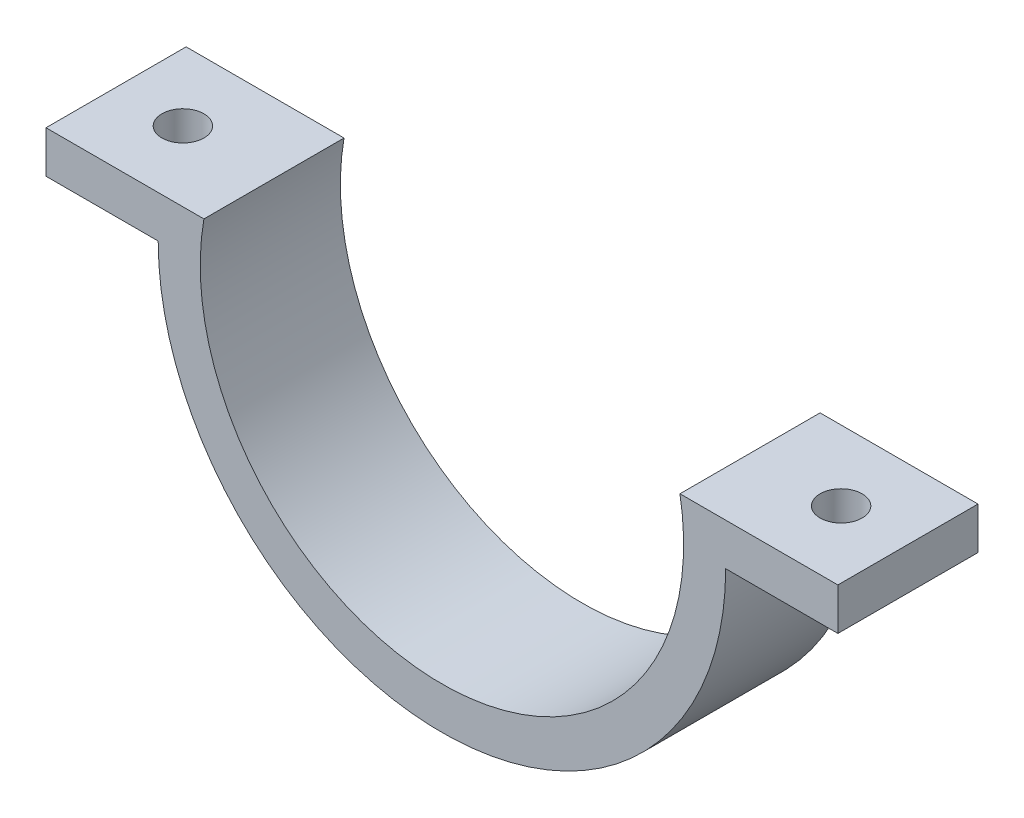
ISO-10303-21;
HEADER;
FILE_DESCRIPTION(('STEP AP214'),'2;1');
FILE_NAME('part.step','',(''),(''),'','','');
FILE_SCHEMA(('AUTOMOTIVE_DESIGN { 1 0 10303 214 1 1 1 1 }'));
ENDSEC;
DATA;
#1=APPLICATION_CONTEXT('core data for automotive mechanical design processes');
#2=APPLICATION_PROTOCOL_DEFINITION('international standard','automotive_design',2000,#1);
#3=PRODUCT_CONTEXT('',#1,'mechanical');
#4=PRODUCT('Part','Part','',(#3));
#5=PRODUCT_RELATED_PRODUCT_CATEGORY('part','',(#4));
#6=PRODUCT_DEFINITION_FORMATION('','',#4);
#7=PRODUCT_DEFINITION_CONTEXT('part definition',#1,'design');
#8=PRODUCT_DEFINITION('design','',#6,#7);
#9=PRODUCT_DEFINITION_SHAPE('','',#8);
#10=(LENGTH_UNIT() NAMED_UNIT(*) SI_UNIT(.MILLI.,.METRE.));
#11=(NAMED_UNIT(*) PLANE_ANGLE_UNIT() SI_UNIT($,.RADIAN.));
#12=(NAMED_UNIT(*) SI_UNIT($,.STERADIAN.) SOLID_ANGLE_UNIT());
#13=UNCERTAINTY_MEASURE_WITH_UNIT(LENGTH_MEASURE(1.E-05),#10,'distance_accuracy_value','');
#14=(GEOMETRIC_REPRESENTATION_CONTEXT(3) GLOBAL_UNCERTAINTY_ASSIGNED_CONTEXT((#13)) GLOBAL_UNIT_ASSIGNED_CONTEXT((#10,
#11,#12)) REPRESENTATION_CONTEXT('',''));
#15=CARTESIAN_POINT('',(0.,0.,0.));
#16=DIRECTION('',(0.,0.,1.));
#17=DIRECTION('',(1.,0.,0.));
#18=AXIS2_PLACEMENT_3D('',#15,#16,#17);
#19=CARTESIAN_POINT('',(0.,0.,10.));
#20=DIRECTION('',(0.,1.,0.));
#21=DIRECTION('',(0.,0.,1.));
#22=AXIS2_PLACEMENT_3D('',#19,#20,#21);
#23=PLANE('',#22);
#24=CARTESIAN_POINT('',(-23.4871275240401,0.,5.));
#25=DIRECTION('',(0.,1.,0.));
#26=DIRECTION('',(0.,0.,1.));
#27=AXIS2_PLACEMENT_3D('',#24,#25,#26);
#28=CIRCLE('',#27,1.5);
#29=CARTESIAN_POINT('',(-23.4871275240401,0.,6.5));
#30=VERTEX_POINT('',#29);
#31=EDGE_CURVE('E146',#30,#30,#28,.F.);
#32=ORIENTED_EDGE('',*,*,#31,.F.);
#33=EDGE_LOOP('',(#32));
#34=FACE_BOUND('',#33,.T.);
#35=DIRECTION('',(1.,0.,0.));
#36=VECTOR('',#35,1.);
#37=CARTESIAN_POINT('',(0.,0.,0.));
#38=LINE('',#37,#36);
#39=CARTESIAN_POINT('',(-28.2571275240401,0.,0.));
#40=VERTEX_POINT('',#39);
#41=CARTESIAN_POINT('',(-20.250000044,0.,0.));
#42=VERTEX_POINT('',#41);
#43=EDGE_CURVE('E142',#40,#42,#38,.T.);
#44=ORIENTED_EDGE('',*,*,#43,.T.);
#45=DIRECTION('',(0.,0.,-1.));
#46=VECTOR('',#45,1.);
#47=CARTESIAN_POINT('',(-20.250000044,0.,10.));
#48=LINE('',#47,#46);
#49=CARTESIAN_POINT('',(-20.250000044,0.,10.));
#50=VERTEX_POINT('',#49);
#51=EDGE_CURVE('E11',#50,#42,#48,.T.);
#52=ORIENTED_EDGE('',*,*,#51,.F.);
#53=DIRECTION('',(1.,0.,0.));
#54=VECTOR('',#53,1.);
#55=CARTESIAN_POINT('',(0.,0.,10.));
#56=LINE('',#55,#54);
#57=CARTESIAN_POINT('',(-28.2571275240401,0.,10.));
#58=VERTEX_POINT('',#57);
#59=EDGE_CURVE('E161',#58,#50,#56,.T.);
#60=ORIENTED_EDGE('',*,*,#59,.F.);
#61=DIRECTION('',(0.,0.,-1.));
#62=VECTOR('',#61,1.);
#63=CARTESIAN_POINT('',(-28.2571275240401,0.,10.));
#64=LINE('',#63,#62);
#65=EDGE_CURVE('E141',#58,#40,#64,.T.);
#66=ORIENTED_EDGE('',*,*,#65,.T.);
#67=EDGE_LOOP('',(#44,#52,#60,#66));
#68=FACE_BOUND('',#67,.T.);
#69=ADVANCED_FACE('F44',(#34,#68),#23,.F.);
#70=CARTESIAN_POINT('',(0.,0.,10.));
#71=DIRECTION('',(0.,0.,-1.));
#72=DIRECTION('',(-1.,0.,0.));
#73=AXIS2_PLACEMENT_3D('',#70,#71,#72);
#74=CYLINDRICAL_SURFACE('',#73,20.250000044);
#75=CARTESIAN_POINT('',(0.,0.,0.));
#76=DIRECTION('',(0.,0.,1.));
#77=DIRECTION('',(1.,0.,0.));
#78=AXIS2_PLACEMENT_3D('',#75,#76,#77);
#79=CIRCLE('',#78,20.250000044);
#80=CARTESIAN_POINT('',(20.250000044,0.,0.));
#81=VERTEX_POINT('',#80);
#82=EDGE_CURVE('E145',#42,#81,#79,.T.);
#83=ORIENTED_EDGE('',*,*,#82,.T.);
#84=DIRECTION('',(0.,0.,-1.));
#85=VECTOR('',#84,1.);
#86=CARTESIAN_POINT('',(20.250000044,0.,10.));
#87=LINE('',#86,#85);
#88=CARTESIAN_POINT('',(20.250000044,0.,10.));
#89=VERTEX_POINT('',#88);
#90=EDGE_CURVE('E52',#89,#81,#87,.T.);
#91=ORIENTED_EDGE('',*,*,#90,.F.);
#92=CARTESIAN_POINT('',(0.,0.,10.));
#93=DIRECTION('',(0.,0.,1.));
#94=DIRECTION('',(1.,0.,0.));
#95=AXIS2_PLACEMENT_3D('',#92,#93,#94);
#96=CIRCLE('',#95,20.250000044);
#97=EDGE_CURVE('E102',#50,#89,#96,.T.);
#98=ORIENTED_EDGE('',*,*,#97,.F.);
#99=ORIENTED_EDGE('',*,*,#51,.T.);
#100=EDGE_LOOP('',(#83,#91,#98,#99));
#101=FACE_BOUND('',#100,.T.);
#102=ADVANCED_FACE('F174',(#101),#74,.T.);
#103=CARTESIAN_POINT('',(0.,0.,10.));
#104=DIRECTION('',(0.,-1.,0.));
#105=DIRECTION('',(0.,0.,-1.));
#106=AXIS2_PLACEMENT_3D('',#103,#104,#105);
#107=PLANE('',#106);
#108=CARTESIAN_POINT('',(23.4871275240401,0.,5.));
#109=DIRECTION('',(0.,1.,0.));
#110=DIRECTION('',(0.,0.,1.));
#111=AXIS2_PLACEMENT_3D('',#108,#109,#110);
#112=CIRCLE('',#111,1.5);
#113=CARTESIAN_POINT('',(23.4871275240401,0.,6.5));
#114=VERTEX_POINT('',#113);
#115=EDGE_CURVE('E193',#114,#114,#112,.T.);
#116=ORIENTED_EDGE('',*,*,#115,.T.);
#117=EDGE_LOOP('',(#116));
#118=FACE_BOUND('',#117,.T.);
#119=DIRECTION('',(-1.,0.,0.));
#120=VECTOR('',#119,1.);
#121=CARTESIAN_POINT('',(0.,0.,0.));
#122=LINE('',#121,#120);
#123=CARTESIAN_POINT('',(28.2571275240401,0.,0.));
#124=VERTEX_POINT('',#123);
#125=EDGE_CURVE('E149',#124,#81,#122,.T.);
#126=ORIENTED_EDGE('',*,*,#125,.F.);
#127=DIRECTION('',(0.,0.,-1.));
#128=VECTOR('',#127,1.);
#129=CARTESIAN_POINT('',(28.2571275240401,0.,10.));
#130=LINE('',#129,#128);
#131=CARTESIAN_POINT('',(28.2571275240401,0.,10.));
#132=VERTEX_POINT('',#131);
#133=EDGE_CURVE('E167',#132,#124,#130,.T.);
#134=ORIENTED_EDGE('',*,*,#133,.F.);
#135=DIRECTION('',(-1.,0.,0.));
#136=VECTOR('',#135,1.);
#137=CARTESIAN_POINT('',(0.,0.,10.));
#138=LINE('',#137,#136);
#139=EDGE_CURVE('E173',#132,#89,#138,.T.);
#140=ORIENTED_EDGE('',*,*,#139,.T.);
#141=ORIENTED_EDGE('',*,*,#90,.T.);
#142=EDGE_LOOP('',(#126,#134,#140,#141));
#143=FACE_BOUND('',#142,.T.);
#144=ADVANCED_FACE('F171',(#118,#143),#107,.T.);
#145=CARTESIAN_POINT('',(28.2571275240401,0.,10.));
#146=DIRECTION('',(1.,0.,0.));
#147=DIRECTION('',(0.,0.,-1.));
#148=AXIS2_PLACEMENT_3D('',#145,#146,#147);
#149=PLANE('',#148);
#150=DIRECTION('',(0.,-1.,0.));
#151=VECTOR('',#150,1.);
#152=CARTESIAN_POINT('',(28.2571275240401,0.,0.));
#153=LINE('',#152,#151);
#154=CARTESIAN_POINT('',(28.2571275240401,3.,0.));
#155=VERTEX_POINT('',#154);
#156=EDGE_CURVE('E152',#155,#124,#153,.T.);
#157=ORIENTED_EDGE('',*,*,#156,.F.);
#158=DIRECTION('',(0.,0.,-1.));
#159=VECTOR('',#158,1.);
#160=CARTESIAN_POINT('',(28.2571275240401,3.,10.));
#161=LINE('',#160,#159);
#162=CARTESIAN_POINT('',(28.2571275240401,3.,10.));
#163=VERTEX_POINT('',#162);
#164=EDGE_CURVE('E165',#163,#155,#161,.T.);
#165=ORIENTED_EDGE('',*,*,#164,.F.);
#166=DIRECTION('',(0.,-1.,0.));
#167=VECTOR('',#166,1.);
#168=CARTESIAN_POINT('',(28.2571275240401,0.,10.));
#169=LINE('',#168,#167);
#170=EDGE_CURVE('E136',#163,#132,#169,.T.);
#171=ORIENTED_EDGE('',*,*,#170,.T.);
#172=ORIENTED_EDGE('',*,*,#133,.T.);
#173=EDGE_LOOP('',(#157,#165,#171,#172));
#174=FACE_BOUND('',#173,.T.);
#175=ADVANCED_FACE('F182',(#174),#149,.T.);
#176=CARTESIAN_POINT('',(0.,3.,10.));
#177=DIRECTION('',(0.,1.,0.));
#178=DIRECTION('',(-1.,0.,0.));
#179=AXIS2_PLACEMENT_3D('',#176,#177,#178);
#180=PLANE('',#179);
#181=CARTESIAN_POINT('',(23.4871275240401,2.99999999999999,5.));
#182=DIRECTION('',(0.,-1.,0.));
#183=DIRECTION('',(1.,0.,0.));
#184=AXIS2_PLACEMENT_3D('',#181,#182,#183);
#185=CIRCLE('',#184,1.5);
#186=CARTESIAN_POINT('',(24.9871275240401,2.99999999999999,5.));
#187=VERTEX_POINT('',#186);
#188=EDGE_CURVE('E196',#187,#187,#185,.T.);
#189=ORIENTED_EDGE('',*,*,#188,.T.);
#190=EDGE_LOOP('',(#189));
#191=FACE_BOUND('',#190,.T.);
#192=DIRECTION('',(1.,0.,0.));
#193=VECTOR('',#192,1.);
#194=CARTESIAN_POINT('',(0.,3.,0.));
#195=LINE('',#194,#193);
#196=CARTESIAN_POINT('',(16.9871275240401,3.,0.));
#197=VERTEX_POINT('',#196);
#198=EDGE_CURVE('E155',#197,#155,#195,.T.);
#199=ORIENTED_EDGE('',*,*,#198,.F.);
#200=DIRECTION('',(0.,0.,-1.));
#201=VECTOR('',#200,1.);
#202=CARTESIAN_POINT('',(16.9871275240401,3.,10.));
#203=LINE('',#202,#201);
#204=CARTESIAN_POINT('',(16.9871275240401,3.,10.));
#205=VERTEX_POINT('',#204);
#206=EDGE_CURVE('E124',#205,#197,#203,.T.);
#207=ORIENTED_EDGE('',*,*,#206,.F.);
#208=DIRECTION('',(1.,0.,0.));
#209=VECTOR('',#208,1.);
#210=CARTESIAN_POINT('',(0.,3.,10.));
#211=LINE('',#210,#209);
#212=EDGE_CURVE('E134',#205,#163,#211,.T.);
#213=ORIENTED_EDGE('',*,*,#212,.T.);
#214=ORIENTED_EDGE('',*,*,#164,.T.);
#215=EDGE_LOOP('',(#199,#207,#213,#214));
#216=FACE_BOUND('',#215,.T.);
#217=ADVANCED_FACE('F200',(#191,#216),#180,.T.);
#218=CARTESIAN_POINT('',(0.,0.,10.));
#219=DIRECTION('',(0.,0.,-1.));
#220=DIRECTION('',(-1.,0.,0.));
#221=AXIS2_PLACEMENT_3D('',#218,#219,#220);
#222=CYLINDRICAL_SURFACE('',#221,17.250000044);
#223=CARTESIAN_POINT('',(0.,0.,0.));
#224=DIRECTION('',(0.,0.,1.));
#225=DIRECTION('',(1.,0.,0.));
#226=AXIS2_PLACEMENT_3D('',#223,#224,#225);
#227=CIRCLE('',#226,17.250000044);
#228=CARTESIAN_POINT('',(-16.9871275240401,3.,0.));
#229=VERTEX_POINT('',#228);
#230=EDGE_CURVE('E123',#229,#197,#227,.T.);
#231=ORIENTED_EDGE('',*,*,#230,.F.);
#232=DIRECTION('',(0.,0.,-1.));
#233=VECTOR('',#232,1.);
#234=CARTESIAN_POINT('',(-16.9871275240401,3.,10.));
#235=LINE('',#234,#233);
#236=CARTESIAN_POINT('',(-16.9871275240401,3.,10.));
#237=VERTEX_POINT('',#236);
#238=EDGE_CURVE('E117',#237,#229,#235,.T.);
#239=ORIENTED_EDGE('',*,*,#238,.F.);
#240=CARTESIAN_POINT('',(0.,0.,10.));
#241=DIRECTION('',(0.,0.,1.));
#242=DIRECTION('',(1.,0.,0.));
#243=AXIS2_PLACEMENT_3D('',#240,#241,#242);
#244=CIRCLE('',#243,17.250000044);
#245=EDGE_CURVE('E121',#237,#205,#244,.T.);
#246=ORIENTED_EDGE('',*,*,#245,.T.);
#247=ORIENTED_EDGE('',*,*,#206,.T.);
#248=EDGE_LOOP('',(#231,#239,#246,#247));
#249=FACE_BOUND('',#248,.T.);
#250=ADVANCED_FACE('F119',(#249),#222,.F.);
#251=CARTESIAN_POINT('',(0.,3.,10.));
#252=DIRECTION('',(0.,-1.,0.));
#253=DIRECTION('',(1.,0.,0.));
#254=AXIS2_PLACEMENT_3D('',#251,#252,#253);
#255=PLANE('',#254);
#256=CARTESIAN_POINT('',(-23.4871275240401,2.99999999999999,5.));
#257=DIRECTION('',(0.,1.,0.));
#258=DIRECTION('',(-1.,0.,0.));
#259=AXIS2_PLACEMENT_3D('',#256,#257,#258);
#260=CIRCLE('',#259,1.5);
#261=CARTESIAN_POINT('',(-24.9871275240401,2.99999999999999,5.));
#262=VERTEX_POINT('',#261);
#263=EDGE_CURVE('E190',#262,#262,#260,.T.);
#264=ORIENTED_EDGE('',*,*,#263,.F.);
#265=EDGE_LOOP('',(#264));
#266=FACE_BOUND('',#265,.T.);
#267=DIRECTION('',(-1.,0.,0.));
#268=VECTOR('',#267,1.);
#269=CARTESIAN_POINT('',(0.,3.,0.));
#270=LINE('',#269,#268);
#271=CARTESIAN_POINT('',(-28.2571275240401,3.,0.));
#272=VERTEX_POINT('',#271);
#273=EDGE_CURVE('E88',#229,#272,#270,.T.);
#274=ORIENTED_EDGE('',*,*,#273,.T.);
#275=DIRECTION('',(0.,0.,-1.));
#276=VECTOR('',#275,1.);
#277=CARTESIAN_POINT('',(-28.2571275240401,3.,10.));
#278=LINE('',#277,#276);
#279=CARTESIAN_POINT('',(-28.2571275240401,3.,10.));
#280=VERTEX_POINT('',#279);
#281=EDGE_CURVE('E125',#280,#272,#278,.T.);
#282=ORIENTED_EDGE('',*,*,#281,.F.);
#283=DIRECTION('',(-1.,0.,0.));
#284=VECTOR('',#283,1.);
#285=CARTESIAN_POINT('',(0.,3.,10.));
#286=LINE('',#285,#284);
#287=EDGE_CURVE('E127',#237,#280,#286,.T.);
#288=ORIENTED_EDGE('',*,*,#287,.F.);
#289=ORIENTED_EDGE('',*,*,#238,.T.);
#290=EDGE_LOOP('',(#274,#282,#288,#289));
#291=FACE_BOUND('',#290,.T.);
#292=ADVANCED_FACE('F128',(#266,#291),#255,.F.);
#293=CARTESIAN_POINT('',(-28.2571275240401,0.,10.));
#294=DIRECTION('',(1.,0.,0.));
#295=DIRECTION('',(0.,0.,-1.));
#296=AXIS2_PLACEMENT_3D('',#293,#294,#295);
#297=PLANE('',#296);
#298=DIRECTION('',(0.,-1.,0.));
#299=VECTOR('',#298,1.);
#300=CARTESIAN_POINT('',(-28.2571275240401,0.,0.));
#301=LINE('',#300,#299);
#302=EDGE_CURVE('E94',#272,#40,#301,.T.);
#303=ORIENTED_EDGE('',*,*,#302,.T.);
#304=ORIENTED_EDGE('',*,*,#65,.F.);
#305=DIRECTION('',(0.,-1.,0.));
#306=VECTOR('',#305,1.);
#307=CARTESIAN_POINT('',(-28.2571275240401,0.,10.));
#308=LINE('',#307,#306);
#309=EDGE_CURVE('E60',#280,#58,#308,.T.);
#310=ORIENTED_EDGE('',*,*,#309,.F.);
#311=ORIENTED_EDGE('',*,*,#281,.T.);
#312=EDGE_LOOP('',(#303,#304,#310,#311));
#313=FACE_BOUND('',#312,.T.);
#314=ADVANCED_FACE('F225',(#313),#297,.F.);
#315=CARTESIAN_POINT('',(0.,0.,10.));
#316=DIRECTION('',(0.,0.,1.));
#317=DIRECTION('',(1.,0.,0.));
#318=AXIS2_PLACEMENT_3D('',#315,#316,#317);
#319=PLANE('',#318);
#320=ORIENTED_EDGE('',*,*,#59,.T.);
#321=ORIENTED_EDGE('',*,*,#97,.T.);
#322=ORIENTED_EDGE('',*,*,#139,.F.);
#323=ORIENTED_EDGE('',*,*,#170,.F.);
#324=ORIENTED_EDGE('',*,*,#212,.F.);
#325=ORIENTED_EDGE('',*,*,#245,.F.);
#326=ORIENTED_EDGE('',*,*,#287,.T.);
#327=ORIENTED_EDGE('',*,*,#309,.T.);
#328=EDGE_LOOP('',(#320,#321,#322,#323,#324,#325,#326,#327));
#329=FACE_BOUND('',#328,.T.);
#330=ADVANCED_FACE('F131',(#329),#319,.T.);
#331=CARTESIAN_POINT('',(0.,0.,0.));
#332=DIRECTION('',(0.,0.,1.));
#333=DIRECTION('',(1.,0.,0.));
#334=AXIS2_PLACEMENT_3D('',#331,#332,#333);
#335=PLANE('',#334);
#336=ORIENTED_EDGE('',*,*,#43,.F.);
#337=ORIENTED_EDGE('',*,*,#302,.F.);
#338=ORIENTED_EDGE('',*,*,#273,.F.);
#339=ORIENTED_EDGE('',*,*,#230,.T.);
#340=ORIENTED_EDGE('',*,*,#198,.T.);
#341=ORIENTED_EDGE('',*,*,#156,.T.);
#342=ORIENTED_EDGE('',*,*,#125,.T.);
#343=ORIENTED_EDGE('',*,*,#82,.F.);
#344=EDGE_LOOP('',(#336,#337,#338,#339,#340,#341,#342,#343));
#345=FACE_BOUND('',#344,.T.);
#346=ADVANCED_FACE('F178',(#345),#335,.F.);
#347=CARTESIAN_POINT('',(-23.4871275240401,-4.24264068711929,5.));
#348=DIRECTION('',(0.,1.,0.));
#349=DIRECTION('',(-1.,0.,0.));
#350=AXIS2_PLACEMENT_3D('',#347,#348,#349);
#351=CYLINDRICAL_SURFACE('',#350,1.5);
#352=ORIENTED_EDGE('',*,*,#31,.T.);
#353=EDGE_LOOP('',(#352));
#354=FACE_BOUND('',#353,.T.);
#355=ORIENTED_EDGE('',*,*,#263,.T.);
#356=EDGE_LOOP('',(#355));
#357=FACE_BOUND('',#356,.T.);
#358=ADVANCED_FACE('F205',(#354,#357),#351,.F.);
#359=CARTESIAN_POINT('',(23.4871275240401,-4.24264068711929,5.));
#360=DIRECTION('',(0.,1.,0.));
#361=DIRECTION('',(-1.,0.,0.));
#362=AXIS2_PLACEMENT_3D('',#359,#360,#361);
#363=CYLINDRICAL_SURFACE('',#362,1.5);
#364=ORIENTED_EDGE('',*,*,#115,.F.);
#365=EDGE_LOOP('',(#364));
#366=FACE_BOUND('',#365,.T.);
#367=ORIENTED_EDGE('',*,*,#188,.F.);
#368=EDGE_LOOP('',(#367));
#369=FACE_BOUND('',#368,.T.);
#370=ADVANCED_FACE('F203',(#366,#369),#363,.F.);
#371=CLOSED_SHELL('',(#69,#102,#144,#175,#217,#250,#292,#314,#330,#346,#358,#370));
#372=MANIFOLD_SOLID_BREP('B2',#371);
#373=ADVANCED_BREP_SHAPE_REPRESENTATION('',(#18,#372),#14);
#374=SHAPE_DEFINITION_REPRESENTATION(#9,#373);
ENDSEC;
END-ISO-10303-21;
